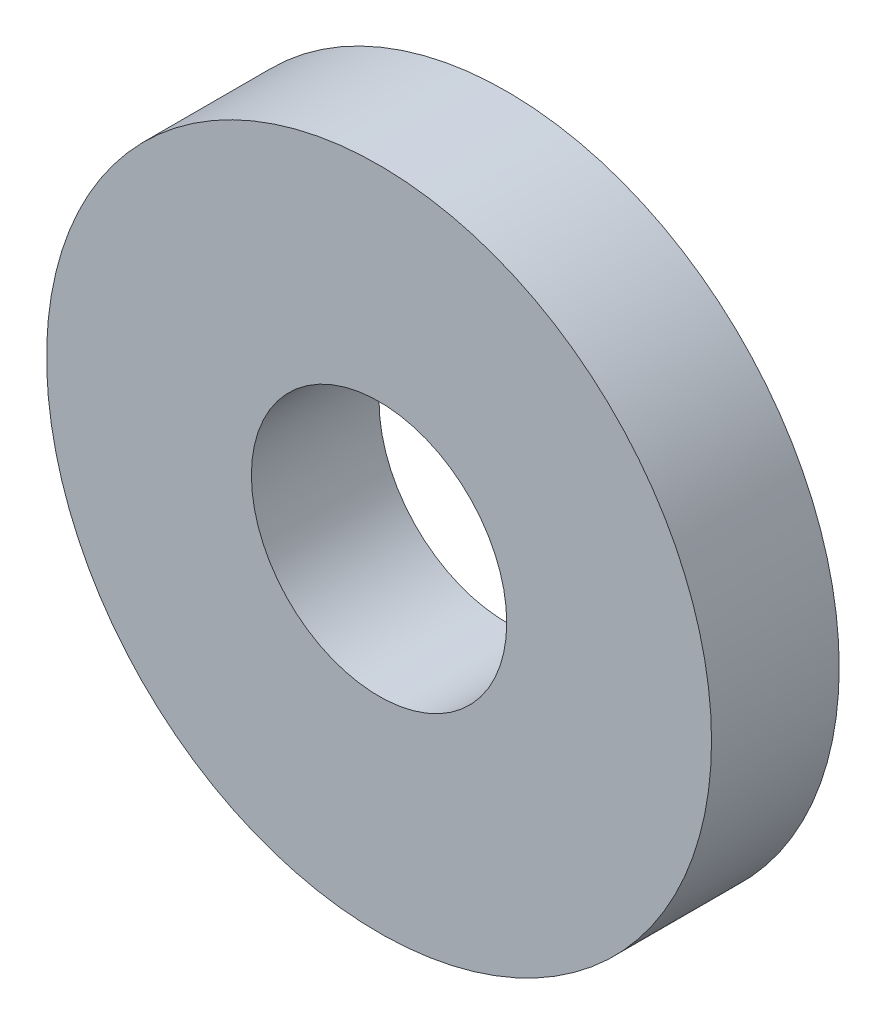
ISO-10303-21;
HEADER;
FILE_DESCRIPTION(('STEP AP214'),'2;1');
FILE_NAME('part.step','',(''),(''),'','','');
FILE_SCHEMA(('AUTOMOTIVE_DESIGN { 1 0 10303 214 1 1 1 1 }'));
ENDSEC;
DATA;
#1=APPLICATION_CONTEXT('core data for automotive mechanical design processes');
#2=APPLICATION_PROTOCOL_DEFINITION('international standard','automotive_design',2000,#1);
#3=PRODUCT_CONTEXT('',#1,'mechanical');
#4=PRODUCT('Part','Part','',(#3));
#5=PRODUCT_RELATED_PRODUCT_CATEGORY('part','',(#4));
#6=PRODUCT_DEFINITION_FORMATION('','',#4);
#7=PRODUCT_DEFINITION_CONTEXT('part definition',#1,'design');
#8=PRODUCT_DEFINITION('design','',#6,#7);
#9=PRODUCT_DEFINITION_SHAPE('','',#8);
#10=(LENGTH_UNIT() NAMED_UNIT(*) SI_UNIT(.MILLI.,.METRE.));
#11=(NAMED_UNIT(*) PLANE_ANGLE_UNIT() SI_UNIT($,.RADIAN.));
#12=(NAMED_UNIT(*) SI_UNIT($,.STERADIAN.) SOLID_ANGLE_UNIT());
#13=UNCERTAINTY_MEASURE_WITH_UNIT(LENGTH_MEASURE(1.E-05),#10,'distance_accuracy_value','');
#14=(GEOMETRIC_REPRESENTATION_CONTEXT(3) GLOBAL_UNCERTAINTY_ASSIGNED_CONTEXT((#13)) GLOBAL_UNIT_ASSIGNED_CONTEXT((#10,
#11,#12)) REPRESENTATION_CONTEXT('',''));
#15=CARTESIAN_POINT('',(0.,0.,0.));
#16=DIRECTION('',(0.,0.,1.));
#17=DIRECTION('',(1.,0.,0.));
#18=AXIS2_PLACEMENT_3D('',#15,#16,#17);
#19=CARTESIAN_POINT('',(-21.,0.,1.5875));
#20=DIRECTION('',(0.,0.,1.));
#21=DIRECTION('',(1.,0.,0.));
#22=AXIS2_PLACEMENT_3D('',#19,#20,#21);
#23=PLANE('',#22);
#24=CARTESIAN_POINT('',(-21.,0.,1.5875));
#25=DIRECTION('',(0.,0.,1.));
#26=DIRECTION('',(1.,0.,0.));
#27=AXIS2_PLACEMENT_3D('',#24,#25,#26);
#28=CIRCLE('',#27,4.13373631574247);
#29=CARTESIAN_POINT('',(-16.8662636842575,0.,1.5875));
#30=VERTEX_POINT('',#29);
#31=EDGE_CURVE('E10',#30,#30,#28,.T.);
#32=ORIENTED_EDGE('',*,*,#31,.T.);
#33=EDGE_LOOP('',(#32));
#34=FACE_BOUND('',#33,.T.);
#35=CARTESIAN_POINT('',(-21.,0.,1.5875));
#36=DIRECTION('',(0.,0.,1.));
#37=DIRECTION('',(1.,0.,0.));
#38=AXIS2_PLACEMENT_3D('',#35,#36,#37);
#39=CIRCLE('',#38,1.5875);
#40=CARTESIAN_POINT('',(-19.4125,0.,1.5875));
#41=VERTEX_POINT('',#40);
#42=EDGE_CURVE('E41',#41,#41,#39,.T.);
#43=ORIENTED_EDGE('',*,*,#42,.F.);
#44=EDGE_LOOP('',(#43));
#45=FACE_BOUND('',#44,.T.);
#46=ADVANCED_FACE('F30',(#34,#45),#23,.T.);
#47=CARTESIAN_POINT('',(-21.,0.,0.));
#48=DIRECTION('',(0.,0.,1.));
#49=DIRECTION('',(1.,0.,0.));
#50=AXIS2_PLACEMENT_3D('',#47,#48,#49);
#51=PLANE('',#50);
#52=CARTESIAN_POINT('',(-21.,0.,0.));
#53=DIRECTION('',(0.,0.,1.));
#54=DIRECTION('',(1.,0.,0.));
#55=AXIS2_PLACEMENT_3D('',#52,#53,#54);
#56=CIRCLE('',#55,4.13373631574247);
#57=CARTESIAN_POINT('',(-16.8662636842575,0.,0.));
#58=VERTEX_POINT('',#57);
#59=EDGE_CURVE('E34',#58,#58,#56,.T.);
#60=ORIENTED_EDGE('',*,*,#59,.F.);
#61=EDGE_LOOP('',(#60));
#62=FACE_BOUND('',#61,.T.);
#63=CARTESIAN_POINT('',(-21.,0.,0.));
#64=DIRECTION('',(0.,0.,1.));
#65=DIRECTION('',(1.,0.,0.));
#66=AXIS2_PLACEMENT_3D('',#63,#64,#65);
#67=CIRCLE('',#66,1.5875);
#68=CARTESIAN_POINT('',(-19.4125,0.,0.));
#69=VERTEX_POINT('',#68);
#70=EDGE_CURVE('E43',#69,#69,#67,.T.);
#71=ORIENTED_EDGE('',*,*,#70,.T.);
#72=EDGE_LOOP('',(#71));
#73=FACE_BOUND('',#72,.T.);
#74=ADVANCED_FACE('F53',(#62,#73),#51,.F.);
#75=CARTESIAN_POINT('',(-21.,0.,1.5875));
#76=DIRECTION('',(0.,0.,-1.));
#77=DIRECTION('',(-1.,0.,0.));
#78=AXIS2_PLACEMENT_3D('',#75,#76,#77);
#79=CYLINDRICAL_SURFACE('',#78,4.13373631574247);
#80=ORIENTED_EDGE('',*,*,#31,.F.);
#81=EDGE_LOOP('',(#80));
#82=FACE_BOUND('',#81,.T.);
#83=ORIENTED_EDGE('',*,*,#59,.T.);
#84=EDGE_LOOP('',(#83));
#85=FACE_BOUND('',#84,.T.);
#86=ADVANCED_FACE('F32',(#82,#85),#79,.T.);
#87=CARTESIAN_POINT('',(-21.,0.,1.5875));
#88=DIRECTION('',(0.,0.,-1.));
#89=DIRECTION('',(-1.,0.,0.));
#90=AXIS2_PLACEMENT_3D('',#87,#88,#89);
#91=CYLINDRICAL_SURFACE('',#90,1.5875);
#92=ORIENTED_EDGE('',*,*,#42,.T.);
#93=EDGE_LOOP('',(#92));
#94=FACE_BOUND('',#93,.T.);
#95=ORIENTED_EDGE('',*,*,#70,.F.);
#96=EDGE_LOOP('',(#95));
#97=FACE_BOUND('',#96,.T.);
#98=ADVANCED_FACE('F49',(#94,#97),#91,.F.);
#99=CLOSED_SHELL('',(#46,#74,#86,#98));
#100=MANIFOLD_SOLID_BREP('B2',#99);
#101=ADVANCED_BREP_SHAPE_REPRESENTATION('',(#18,#100),#14);
#102=SHAPE_DEFINITION_REPRESENTATION(#9,#101);
ENDSEC;
END-ISO-10303-21;
